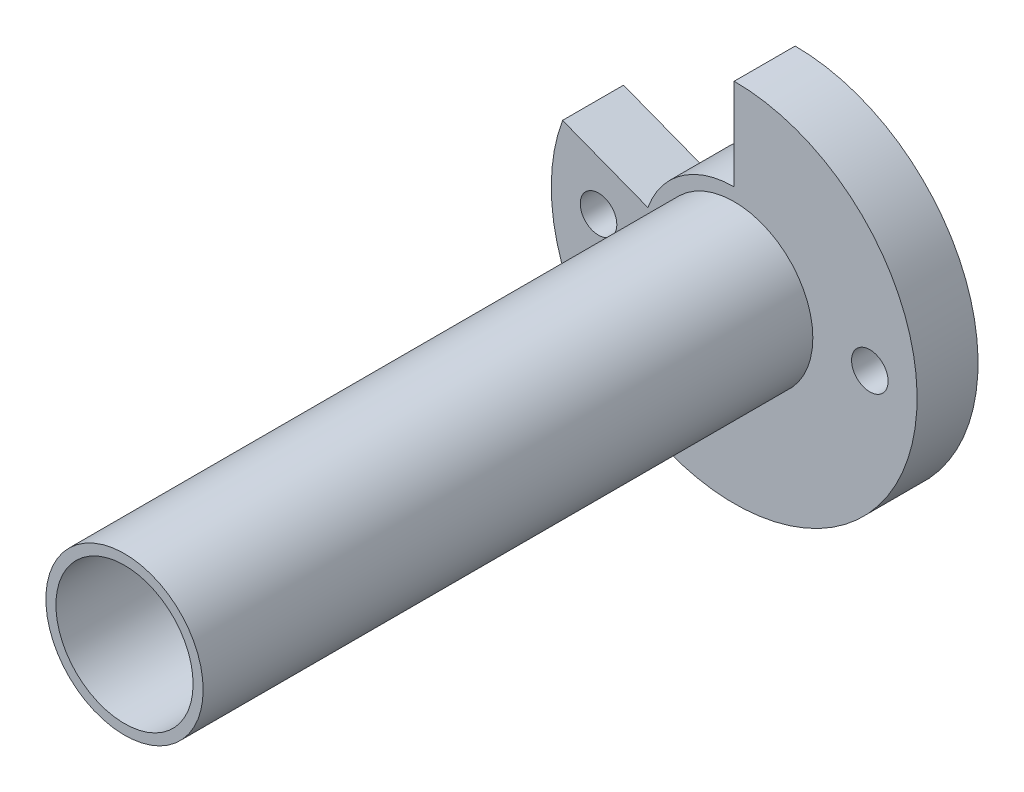
ISO-10303-21;
HEADER;
FILE_DESCRIPTION(('STEP AP214'),'2;1');
FILE_NAME('part.step','',(''),(''),'','','');
FILE_SCHEMA(('AUTOMOTIVE_DESIGN { 1 0 10303 214 1 1 1 1 }'));
ENDSEC;
DATA;
#1=APPLICATION_CONTEXT('core data for automotive mechanical design processes');
#2=APPLICATION_PROTOCOL_DEFINITION('international standard','automotive_design',2000,#1);
#3=PRODUCT_CONTEXT('',#1,'mechanical');
#4=PRODUCT('Part','Part','',(#3));
#5=PRODUCT_RELATED_PRODUCT_CATEGORY('part','',(#4));
#6=PRODUCT_DEFINITION_FORMATION('','',#4);
#7=PRODUCT_DEFINITION_CONTEXT('part definition',#1,'design');
#8=PRODUCT_DEFINITION('design','',#6,#7);
#9=PRODUCT_DEFINITION_SHAPE('','',#8);
#10=(LENGTH_UNIT() NAMED_UNIT(*) SI_UNIT(.MILLI.,.METRE.));
#11=(NAMED_UNIT(*) PLANE_ANGLE_UNIT() SI_UNIT($,.RADIAN.));
#12=(NAMED_UNIT(*) SI_UNIT($,.STERADIAN.) SOLID_ANGLE_UNIT());
#13=UNCERTAINTY_MEASURE_WITH_UNIT(LENGTH_MEASURE(1.E-05),#10,'distance_accuracy_value','');
#14=(GEOMETRIC_REPRESENTATION_CONTEXT(3) GLOBAL_UNCERTAINTY_ASSIGNED_CONTEXT((#13)) GLOBAL_UNIT_ASSIGNED_CONTEXT((#10,
#11,#12)) REPRESENTATION_CONTEXT('',''));
#15=CARTESIAN_POINT('',(0.,0.,0.));
#16=DIRECTION('',(0.,0.,1.));
#17=DIRECTION('',(1.,0.,0.));
#18=AXIS2_PLACEMENT_3D('',#15,#16,#17);
#19=CARTESIAN_POINT('',(0.,0.,0.));
#20=DIRECTION('',(0.,0.,1.));
#21=DIRECTION('',(1.,0.,0.));
#22=AXIS2_PLACEMENT_3D('',#19,#20,#21);
#23=PLANE('',#22);
#24=CARTESIAN_POINT('',(0.,0.,0.));
#25=DIRECTION('',(0.,0.,1.));
#26=DIRECTION('',(1.,0.,0.));
#27=AXIS2_PLACEMENT_3D('',#24,#25,#26);
#28=CIRCLE('',#27,30.);
#29=CARTESIAN_POINT('',(-28.1520792610295,10.3663124244214,0.));
#30=VERTEX_POINT('',#29);
#31=CARTESIAN_POINT('',(0.,30.,0.));
#32=VERTEX_POINT('',#31);
#33=EDGE_CURVE('E116',#30,#32,#28,.T.);
#34=ORIENTED_EDGE('',*,*,#33,.F.);
#35=DIRECTION('',(0.933335005797753,-0.359006639148232,0.));
#36=VECTOR('',#35,1.);
#37=CARTESIAN_POINT('',(-0.154926117735226,-0.402772409272707,0.));
#38=LINE('',#37,#36);
#39=CARTESIAN_POINT('',(-14.149156243827,4.98009815041549,0.));
#40=VERTEX_POINT('',#39);
#41=EDGE_CURVE('E40',#30,#40,#38,.T.);
#42=ORIENTED_EDGE('',*,*,#41,.T.);
#43=CARTESIAN_POINT('',(0.,0.,0.));
#44=DIRECTION('',(0.,0.,1.));
#45=DIRECTION('',(1.,0.,0.));
#46=AXIS2_PLACEMENT_3D('',#43,#44,#45);
#47=CIRCLE('',#46,15.);
#48=CARTESIAN_POINT('',(0.,15.,0.));
#49=VERTEX_POINT('',#48);
#50=EDGE_CURVE('E55',#40,#49,#47,.F.);
#51=ORIENTED_EDGE('',*,*,#50,.T.);
#52=DIRECTION('',(0.,1.,0.));
#53=VECTOR('',#52,1.);
#54=CARTESIAN_POINT('',(0.,0.,0.));
#55=LINE('',#54,#53);
#56=EDGE_CURVE('E76',#49,#32,#55,.T.);
#57=ORIENTED_EDGE('',*,*,#56,.T.);
#58=EDGE_LOOP('',(#34,#42,#51,#57));
#59=FACE_BOUND('',#58,.T.);
#60=CARTESIAN_POINT('',(22.25,0.,0.));
#61=DIRECTION('',(0.,0.,1.));
#62=DIRECTION('',(1.,0.,0.));
#63=AXIS2_PLACEMENT_3D('',#60,#61,#62);
#64=CIRCLE('',#63,2.99999999999999);
#65=CARTESIAN_POINT('',(25.25,0.,0.));
#66=VERTEX_POINT('',#65);
#67=EDGE_CURVE('E110',#66,#66,#64,.T.);
#68=ORIENTED_EDGE('',*,*,#67,.T.);
#69=EDGE_LOOP('',(#68));
#70=FACE_BOUND('',#69,.T.);
#71=CARTESIAN_POINT('',(-22.25,0.,0.));
#72=DIRECTION('',(0.,0.,1.));
#73=DIRECTION('',(1.,0.,0.));
#74=AXIS2_PLACEMENT_3D('',#71,#72,#73);
#75=CIRCLE('',#74,2.99999999999999);
#76=CARTESIAN_POINT('',(-19.25,0.,0.));
#77=VERTEX_POINT('',#76);
#78=EDGE_CURVE('E104',#77,#77,#75,.T.);
#79=ORIENTED_EDGE('',*,*,#78,.T.);
#80=EDGE_LOOP('',(#79));
#81=FACE_BOUND('',#80,.T.);
#82=CARTESIAN_POINT('',(-15.7331258814007,-15.7331258814007,0.));
#83=DIRECTION('',(0.,0.,-1.));
#84=DIRECTION('',(-1.,0.,0.));
#85=AXIS2_PLACEMENT_3D('',#82,#83,#84);
#86=CIRCLE('',#85,1.24999999999999);
#87=CARTESIAN_POINT('',(-16.9831258814007,-15.7331258814007,0.));
#88=VERTEX_POINT('',#87);
#89=EDGE_CURVE('E225',#88,#88,#86,.T.);
#90=ORIENTED_EDGE('',*,*,#89,.F.);
#91=EDGE_LOOP('',(#90));
#92=FACE_BOUND('',#91,.T.);
#93=CARTESIAN_POINT('',(15.7331258814007,-15.7331258814007,0.));
#94=DIRECTION('',(0.,0.,-1.));
#95=DIRECTION('',(-1.,0.,0.));
#96=AXIS2_PLACEMENT_3D('',#93,#94,#95);
#97=CIRCLE('',#96,1.24999999999999);
#98=CARTESIAN_POINT('',(14.4831258814007,-15.7331258814007,0.));
#99=VERTEX_POINT('',#98);
#100=EDGE_CURVE('E219',#99,#99,#97,.T.);
#101=ORIENTED_EDGE('',*,*,#100,.F.);
#102=EDGE_LOOP('',(#101));
#103=FACE_BOUND('',#102,.T.);
#104=CARTESIAN_POINT('',(15.7331258814007,15.7331258814007,0.));
#105=DIRECTION('',(0.,0.,-1.));
#106=DIRECTION('',(-1.,0.,0.));
#107=AXIS2_PLACEMENT_3D('',#104,#105,#106);
#108=CIRCLE('',#107,1.24999999999999);
#109=CARTESIAN_POINT('',(14.4831258814007,15.7331258814007,0.));
#110=VERTEX_POINT('',#109);
#111=EDGE_CURVE('E213',#110,#110,#108,.T.);
#112=ORIENTED_EDGE('',*,*,#111,.F.);
#113=EDGE_LOOP('',(#112));
#114=FACE_BOUND('',#113,.T.);
#115=CARTESIAN_POINT('',(0.,0.,0.));
#116=DIRECTION('',(0.,0.,-1.));
#117=DIRECTION('',(-1.,0.,0.));
#118=AXIS2_PLACEMENT_3D('',#115,#116,#117);
#119=CIRCLE('',#118,9.99999999999999);
#120=CARTESIAN_POINT('',(-9.99999999999999,0.,0.));
#121=VERTEX_POINT('',#120);
#122=EDGE_CURVE('E200',#121,#121,#119,.T.);
#123=ORIENTED_EDGE('',*,*,#122,.F.);
#124=EDGE_LOOP('',(#123));
#125=FACE_BOUND('',#124,.T.);
#126=ADVANCED_FACE('F32',(#59,#70,#81,#92,#103,#114,#125),#23,.F.);
#127=CARTESIAN_POINT('',(0.,0.,10.));
#128=DIRECTION('',(0.,0.,1.));
#129=DIRECTION('',(1.,0.,0.));
#130=AXIS2_PLACEMENT_3D('',#127,#128,#129);
#131=PLANE('',#130);
#132=DIRECTION('',(0.933335005797753,-0.359006639148232,0.));
#133=VECTOR('',#132,1.);
#134=CARTESIAN_POINT('',(-28.1520792610295,10.3663124244214,10.));
#135=LINE('',#134,#133);
#136=CARTESIAN_POINT('',(-28.1520792610295,10.3663124244214,10.));
#137=VERTEX_POINT('',#136);
#138=CARTESIAN_POINT('',(-14.149156243827,4.98009815041549,10.));
#139=VERTEX_POINT('',#138);
#140=EDGE_CURVE('E77',#137,#139,#135,.T.);
#141=ORIENTED_EDGE('',*,*,#140,.F.);
#142=CARTESIAN_POINT('',(0.,0.,10.));
#143=DIRECTION('',(0.,0.,1.));
#144=DIRECTION('',(1.,0.,0.));
#145=AXIS2_PLACEMENT_3D('',#142,#143,#144);
#146=CIRCLE('',#145,30.);
#147=CARTESIAN_POINT('',(0.,30.,10.));
#148=VERTEX_POINT('',#147);
#149=EDGE_CURVE('E92',#137,#148,#146,.T.);
#150=ORIENTED_EDGE('',*,*,#149,.T.);
#151=DIRECTION('',(0.,1.,0.));
#152=VECTOR('',#151,1.);
#153=CARTESIAN_POINT('',(0.,15.,10.));
#154=LINE('',#153,#152);
#155=CARTESIAN_POINT('',(0.,15.,10.));
#156=VERTEX_POINT('',#155);
#157=EDGE_CURVE('E75',#156,#148,#154,.T.);
#158=ORIENTED_EDGE('',*,*,#157,.F.);
#159=CARTESIAN_POINT('',(0.,0.,10.));
#160=DIRECTION('',(0.,0.,-1.));
#161=DIRECTION('',(-1.,0.,0.));
#162=AXIS2_PLACEMENT_3D('',#159,#160,#161);
#163=CIRCLE('',#162,15.);
#164=EDGE_CURVE('E80',#139,#156,#163,.T.);
#165=ORIENTED_EDGE('',*,*,#164,.F.);
#166=EDGE_LOOP('',(#141,#150,#158,#165));
#167=FACE_BOUND('',#166,.T.);
#168=CARTESIAN_POINT('',(-22.25,0.,10.));
#169=DIRECTION('',(0.,0.,1.));
#170=DIRECTION('',(1.,0.,0.));
#171=AXIS2_PLACEMENT_3D('',#168,#169,#170);
#172=CIRCLE('',#171,2.99999999999999);
#173=CARTESIAN_POINT('',(-19.25,0.,10.));
#174=VERTEX_POINT('',#173);
#175=EDGE_CURVE('E98',#174,#174,#172,.T.);
#176=ORIENTED_EDGE('',*,*,#175,.F.);
#177=EDGE_LOOP('',(#176));
#178=FACE_BOUND('',#177,.T.);
#179=CARTESIAN_POINT('',(22.25,0.,10.));
#180=DIRECTION('',(0.,0.,1.));
#181=DIRECTION('',(1.,0.,0.));
#182=AXIS2_PLACEMENT_3D('',#179,#180,#181);
#183=CIRCLE('',#182,2.99999999999999);
#184=CARTESIAN_POINT('',(25.25,0.,10.));
#185=VERTEX_POINT('',#184);
#186=EDGE_CURVE('E107',#185,#185,#183,.T.);
#187=ORIENTED_EDGE('',*,*,#186,.F.);
#188=EDGE_LOOP('',(#187));
#189=FACE_BOUND('',#188,.T.);
#190=CARTESIAN_POINT('',(0.,0.,10.));
#191=DIRECTION('',(0.,0.,1.));
#192=DIRECTION('',(1.,0.,0.));
#193=AXIS2_PLACEMENT_3D('',#190,#191,#192);
#194=CIRCLE('',#193,12.9);
#195=CARTESIAN_POINT('',(12.9,0.,10.));
#196=VERTEX_POINT('',#195);
#197=EDGE_CURVE('E113',#196,#196,#194,.T.);
#198=ORIENTED_EDGE('',*,*,#197,.F.);
#199=EDGE_LOOP('',(#198));
#200=FACE_BOUND('',#199,.T.);
#201=ADVANCED_FACE('F89',(#167,#178,#189,#200),#131,.T.);
#202=CARTESIAN_POINT('',(0.,0.,10.));
#203=DIRECTION('',(0.,0.,-1.));
#204=DIRECTION('',(-1.,0.,0.));
#205=AXIS2_PLACEMENT_3D('',#202,#203,#204);
#206=CYLINDRICAL_SURFACE('',#205,30.);
#207=ORIENTED_EDGE('',*,*,#149,.F.);
#208=DIRECTION('',(0.,0.,1.));
#209=VECTOR('',#208,1.);
#210=CARTESIAN_POINT('',(-28.1520792610295,10.3663124244214,-40.));
#211=LINE('',#210,#209);
#212=EDGE_CURVE('E99',#30,#137,#211,.T.);
#213=ORIENTED_EDGE('',*,*,#212,.F.);
#214=ORIENTED_EDGE('',*,*,#33,.T.);
#215=DIRECTION('',(0.,0.,1.));
#216=VECTOR('',#215,1.);
#217=CARTESIAN_POINT('',(0.,30.,-40.));
#218=LINE('',#217,#216);
#219=EDGE_CURVE('E47',#32,#148,#218,.T.);
#220=ORIENTED_EDGE('',*,*,#219,.T.);
#221=EDGE_LOOP('',(#207,#213,#214,#220));
#222=FACE_BOUND('',#221,.T.);
#223=ADVANCED_FACE('F34',(#222),#206,.T.);
#224=CARTESIAN_POINT('',(0.,0.,60.));
#225=DIRECTION('',(0.,0.,-1.));
#226=DIRECTION('',(-1.,0.,0.));
#227=AXIS2_PLACEMENT_3D('',#224,#225,#226);
#228=CYLINDRICAL_SURFACE('',#227,12.9);
#229=ORIENTED_EDGE('',*,*,#197,.T.);
#230=EDGE_LOOP('',(#229));
#231=FACE_BOUND('',#230,.T.);
#232=CARTESIAN_POINT('',(0.,0.,110.));
#233=DIRECTION('',(0.,0.,1.));
#234=DIRECTION('',(1.,0.,0.));
#235=AXIS2_PLACEMENT_3D('',#232,#233,#234);
#236=CIRCLE('',#235,12.9);
#237=CARTESIAN_POINT('',(12.9,0.,110.));
#238=VERTEX_POINT('',#237);
#239=EDGE_CURVE('E207',#238,#238,#236,.T.);
#240=ORIENTED_EDGE('',*,*,#239,.F.);
#241=EDGE_LOOP('',(#240));
#242=FACE_BOUND('',#241,.T.);
#243=ADVANCED_FACE('F130',(#231,#242),#228,.T.);
#244=CARTESIAN_POINT('',(22.25,0.,10.));
#245=DIRECTION('',(0.,0.,1.));
#246=DIRECTION('',(1.,0.,0.));
#247=AXIS2_PLACEMENT_3D('',#244,#245,#246);
#248=CYLINDRICAL_SURFACE('',#247,2.99999999999999);
#249=ORIENTED_EDGE('',*,*,#67,.F.);
#250=EDGE_LOOP('',(#249));
#251=FACE_BOUND('',#250,.T.);
#252=ORIENTED_EDGE('',*,*,#186,.T.);
#253=EDGE_LOOP('',(#252));
#254=FACE_BOUND('',#253,.T.);
#255=ADVANCED_FACE('F135',(#251,#254),#248,.F.);
#256=CARTESIAN_POINT('',(-22.25,0.,10.));
#257=DIRECTION('',(0.,0.,1.));
#258=DIRECTION('',(1.,0.,0.));
#259=AXIS2_PLACEMENT_3D('',#256,#257,#258);
#260=CYLINDRICAL_SURFACE('',#259,2.99999999999999);
#261=ORIENTED_EDGE('',*,*,#78,.F.);
#262=EDGE_LOOP('',(#261));
#263=FACE_BOUND('',#262,.T.);
#264=ORIENTED_EDGE('',*,*,#175,.T.);
#265=EDGE_LOOP('',(#264));
#266=FACE_BOUND('',#265,.T.);
#267=ADVANCED_FACE('F151',(#263,#266),#260,.F.);
#268=CARTESIAN_POINT('',(0.,0.,-40.));
#269=DIRECTION('',(0.,0.,1.));
#270=DIRECTION('',(1.,0.,0.));
#271=AXIS2_PLACEMENT_3D('',#268,#269,#270);
#272=CYLINDRICAL_SURFACE('',#271,15.);
#273=DIRECTION('',(0.,0.,1.));
#274=VECTOR('',#273,1.);
#275=CARTESIAN_POINT('',(-14.149156243827,4.98009815041549,-40.));
#276=LINE('',#275,#274);
#277=EDGE_CURVE('E82',#40,#139,#276,.T.);
#278=ORIENTED_EDGE('',*,*,#277,.T.);
#279=ORIENTED_EDGE('',*,*,#164,.T.);
#280=DIRECTION('',(0.,0.,1.));
#281=VECTOR('',#280,1.);
#282=CARTESIAN_POINT('',(0.,15.,-40.));
#283=LINE('',#282,#281);
#284=EDGE_CURVE('E71',#49,#156,#283,.T.);
#285=ORIENTED_EDGE('',*,*,#284,.F.);
#286=ORIENTED_EDGE('',*,*,#50,.F.);
#287=EDGE_LOOP('',(#278,#279,#285,#286));
#288=FACE_BOUND('',#287,.T.);
#289=ADVANCED_FACE('F81',(#288),#272,.T.);
#290=CARTESIAN_POINT('',(-28.1520792610295,10.3663124244214,-40.));
#291=DIRECTION('',(-0.359006639148232,-0.933335005797753,0.));
#292=DIRECTION('',(0.933335005797753,-0.359006639148232,0.));
#293=AXIS2_PLACEMENT_3D('',#290,#291,#292);
#294=PLANE('',#293);
#295=ORIENTED_EDGE('',*,*,#212,.T.);
#296=ORIENTED_EDGE('',*,*,#140,.T.);
#297=ORIENTED_EDGE('',*,*,#277,.F.);
#298=ORIENTED_EDGE('',*,*,#41,.F.);
#299=EDGE_LOOP('',(#295,#296,#297,#298));
#300=FACE_BOUND('',#299,.T.);
#301=ADVANCED_FACE('F127',(#300),#294,.F.);
#302=CARTESIAN_POINT('',(0.,15.,-40.));
#303=DIRECTION('',(1.,0.,0.));
#304=DIRECTION('',(0.,0.,-1.));
#305=AXIS2_PLACEMENT_3D('',#302,#303,#304);
#306=PLANE('',#305);
#307=ORIENTED_EDGE('',*,*,#284,.T.);
#308=ORIENTED_EDGE('',*,*,#157,.T.);
#309=ORIENTED_EDGE('',*,*,#219,.F.);
#310=ORIENTED_EDGE('',*,*,#56,.F.);
#311=EDGE_LOOP('',(#307,#308,#309,#310));
#312=FACE_BOUND('',#311,.T.);
#313=ADVANCED_FACE('F73',(#312),#306,.F.);
#314=CARTESIAN_POINT('',(-15.7331258814007,-15.7331258814007,5.));
#315=DIRECTION('',(0.,0.,1.));
#316=DIRECTION('',(1.,0.,0.));
#317=AXIS2_PLACEMENT_3D('',#314,#315,#316);
#318=PLANE('',#317);
#319=CARTESIAN_POINT('',(-15.7331258814007,-15.7331258814007,5.));
#320=DIRECTION('',(0.,0.,-1.));
#321=DIRECTION('',(-1.,0.,0.));
#322=AXIS2_PLACEMENT_3D('',#319,#320,#321);
#323=CIRCLE('',#322,1.24999999999999);
#324=CARTESIAN_POINT('',(-16.9831258814007,-15.7331258814007,5.));
#325=VERTEX_POINT('',#324);
#326=EDGE_CURVE('E86',#325,#325,#323,.T.);
#327=ORIENTED_EDGE('',*,*,#326,.T.);
#328=EDGE_LOOP('',(#327));
#329=FACE_BOUND('',#328,.T.);
#330=ADVANCED_FACE('F160',(#329),#318,.F.);
#331=CARTESIAN_POINT('',(-15.7331258814007,-15.7331258814007,0.));
#332=DIRECTION('',(0.,0.,-1.));
#333=DIRECTION('',(-1.,0.,0.));
#334=AXIS2_PLACEMENT_3D('',#331,#332,#333);
#335=CYLINDRICAL_SURFACE('',#334,1.24999999999999);
#336=ORIENTED_EDGE('',*,*,#326,.F.);
#337=EDGE_LOOP('',(#336));
#338=FACE_BOUND('',#337,.T.);
#339=ORIENTED_EDGE('',*,*,#89,.T.);
#340=EDGE_LOOP('',(#339));
#341=FACE_BOUND('',#340,.T.);
#342=ADVANCED_FACE('F165',(#338,#341),#335,.F.);
#343=CARTESIAN_POINT('',(15.7331258814007,-15.7331258814007,5.));
#344=DIRECTION('',(0.,0.,1.));
#345=DIRECTION('',(1.,0.,0.));
#346=AXIS2_PLACEMENT_3D('',#343,#344,#345);
#347=PLANE('',#346);
#348=CARTESIAN_POINT('',(15.7331258814007,-15.7331258814007,5.));
#349=DIRECTION('',(0.,0.,-1.));
#350=DIRECTION('',(-1.,0.,0.));
#351=AXIS2_PLACEMENT_3D('',#348,#349,#350);
#352=CIRCLE('',#351,1.24999999999999);
#353=CARTESIAN_POINT('',(14.4831258814007,-15.7331258814007,5.));
#354=VERTEX_POINT('',#353);
#355=EDGE_CURVE('E222',#354,#354,#352,.T.);
#356=ORIENTED_EDGE('',*,*,#355,.T.);
#357=EDGE_LOOP('',(#356));
#358=FACE_BOUND('',#357,.T.);
#359=ADVANCED_FACE('F169',(#358),#347,.F.);
#360=CARTESIAN_POINT('',(15.7331258814007,-15.7331258814007,0.));
#361=DIRECTION('',(0.,0.,-1.));
#362=DIRECTION('',(-1.,0.,0.));
#363=AXIS2_PLACEMENT_3D('',#360,#361,#362);
#364=CYLINDRICAL_SURFACE('',#363,1.24999999999999);
#365=ORIENTED_EDGE('',*,*,#355,.F.);
#366=EDGE_LOOP('',(#365));
#367=FACE_BOUND('',#366,.T.);
#368=ORIENTED_EDGE('',*,*,#100,.T.);
#369=EDGE_LOOP('',(#368));
#370=FACE_BOUND('',#369,.T.);
#371=ADVANCED_FACE('F173',(#367,#370),#364,.F.);
#372=CARTESIAN_POINT('',(15.7331258814007,15.7331258814007,5.));
#373=DIRECTION('',(0.,0.,1.));
#374=DIRECTION('',(1.,0.,0.));
#375=AXIS2_PLACEMENT_3D('',#372,#373,#374);
#376=PLANE('',#375);
#377=CARTESIAN_POINT('',(15.7331258814007,15.7331258814007,5.));
#378=DIRECTION('',(0.,0.,-1.));
#379=DIRECTION('',(-1.,0.,0.));
#380=AXIS2_PLACEMENT_3D('',#377,#378,#379);
#381=CIRCLE('',#380,1.24999999999999);
#382=CARTESIAN_POINT('',(14.4831258814007,15.7331258814007,5.));
#383=VERTEX_POINT('',#382);
#384=EDGE_CURVE('E216',#383,#383,#381,.T.);
#385=ORIENTED_EDGE('',*,*,#384,.T.);
#386=EDGE_LOOP('',(#385));
#387=FACE_BOUND('',#386,.T.);
#388=ADVANCED_FACE('F177',(#387),#376,.F.);
#389=CARTESIAN_POINT('',(15.7331258814007,15.7331258814007,0.));
#390=DIRECTION('',(0.,0.,-1.));
#391=DIRECTION('',(-1.,0.,0.));
#392=AXIS2_PLACEMENT_3D('',#389,#390,#391);
#393=CYLINDRICAL_SURFACE('',#392,1.24999999999999);
#394=ORIENTED_EDGE('',*,*,#384,.F.);
#395=EDGE_LOOP('',(#394));
#396=FACE_BOUND('',#395,.T.);
#397=ORIENTED_EDGE('',*,*,#111,.T.);
#398=EDGE_LOOP('',(#397));
#399=FACE_BOUND('',#398,.T.);
#400=ADVANCED_FACE('F181',(#396,#399),#393,.F.);
#401=CARTESIAN_POINT('',(0.,0.,110.));
#402=DIRECTION('',(0.,0.,1.));
#403=DIRECTION('',(1.,0.,0.));
#404=AXIS2_PLACEMENT_3D('',#401,#402,#403);
#405=PLANE('',#404);
#406=ORIENTED_EDGE('',*,*,#239,.T.);
#407=EDGE_LOOP('',(#406));
#408=FACE_BOUND('',#407,.T.);
#409=CARTESIAN_POINT('',(0.,0.,110.));
#410=DIRECTION('',(0.,0.,1.));
#411=DIRECTION('',(1.,0.,0.));
#412=AXIS2_PLACEMENT_3D('',#409,#410,#411);
#413=CIRCLE('',#412,11.25);
#414=CARTESIAN_POINT('',(11.25,0.,110.));
#415=VERTEX_POINT('',#414);
#416=EDGE_CURVE('E204',#415,#415,#413,.T.);
#417=ORIENTED_EDGE('',*,*,#416,.F.);
#418=EDGE_LOOP('',(#417));
#419=FACE_BOUND('',#418,.T.);
#420=ADVANCED_FACE('F185',(#408,#419),#405,.T.);
#421=CARTESIAN_POINT('',(0.,0.,110.));
#422=DIRECTION('',(0.,0.,-1.));
#423=DIRECTION('',(-1.,0.,0.));
#424=AXIS2_PLACEMENT_3D('',#421,#422,#423);
#425=CYLINDRICAL_SURFACE('',#424,11.25);
#426=ORIENTED_EDGE('',*,*,#416,.T.);
#427=EDGE_LOOP('',(#426));
#428=FACE_BOUND('',#427,.T.);
#429=CARTESIAN_POINT('',(0.,0.,60.));
#430=DIRECTION('',(0.,0.,1.));
#431=DIRECTION('',(1.,0.,0.));
#432=AXIS2_PLACEMENT_3D('',#429,#430,#431);
#433=CIRCLE('',#432,11.25);
#434=CARTESIAN_POINT('',(11.25,0.,60.));
#435=VERTEX_POINT('',#434);
#436=EDGE_CURVE('E11',#435,#435,#433,.F.);
#437=ORIENTED_EDGE('',*,*,#436,.T.);
#438=EDGE_LOOP('',(#437));
#439=FACE_BOUND('',#438,.T.);
#440=ADVANCED_FACE('F147',(#428,#439),#425,.F.);
#441=CARTESIAN_POINT('',(0.,0.,60.));
#442=DIRECTION('',(0.,0.,1.));
#443=DIRECTION('',(1.,0.,0.));
#444=AXIS2_PLACEMENT_3D('',#441,#442,#443);
#445=PLANE('',#444);
#446=CARTESIAN_POINT('',(0.,0.,60.));
#447=DIRECTION('',(0.,0.,1.));
#448=DIRECTION('',(1.,0.,0.));
#449=AXIS2_PLACEMENT_3D('',#446,#447,#448);
#450=CIRCLE('',#449,9.99999999999999);
#451=CARTESIAN_POINT('',(9.99999999999999,0.,60.));
#452=VERTEX_POINT('',#451);
#453=EDGE_CURVE('E203',#452,#452,#450,.T.);
#454=ORIENTED_EDGE('',*,*,#453,.F.);
#455=EDGE_LOOP('',(#454));
#456=FACE_BOUND('',#455,.T.);
#457=ORIENTED_EDGE('',*,*,#436,.F.);
#458=EDGE_LOOP('',(#457));
#459=FACE_BOUND('',#458,.T.);
#460=ADVANCED_FACE('F143',(#456,#459),#445,.T.);
#461=CARTESIAN_POINT('',(0.,0.,0.));
#462=DIRECTION('',(0.,0.,-1.));
#463=DIRECTION('',(-1.,0.,0.));
#464=AXIS2_PLACEMENT_3D('',#461,#462,#463);
#465=CYLINDRICAL_SURFACE('',#464,9.99999999999999);
#466=ORIENTED_EDGE('',*,*,#122,.T.);
#467=EDGE_LOOP('',(#466));
#468=FACE_BOUND('',#467,.T.);
#469=ORIENTED_EDGE('',*,*,#453,.T.);
#470=EDGE_LOOP('',(#469));
#471=FACE_BOUND('',#470,.T.);
#472=ADVANCED_FACE('F146',(#468,#471),#465,.F.);
#473=CLOSED_SHELL('',(#126,#201,#223,#243,#255,#267,#289,#301,#313,#330,#342,#359,#371,#388,
#400,#420,#440,#460,#472));
#474=MANIFOLD_SOLID_BREP('B2',#473);
#475=ADVANCED_BREP_SHAPE_REPRESENTATION('',(#18,#474),#14);
#476=SHAPE_DEFINITION_REPRESENTATION(#9,#475);
ENDSEC;
END-ISO-10303-21;
